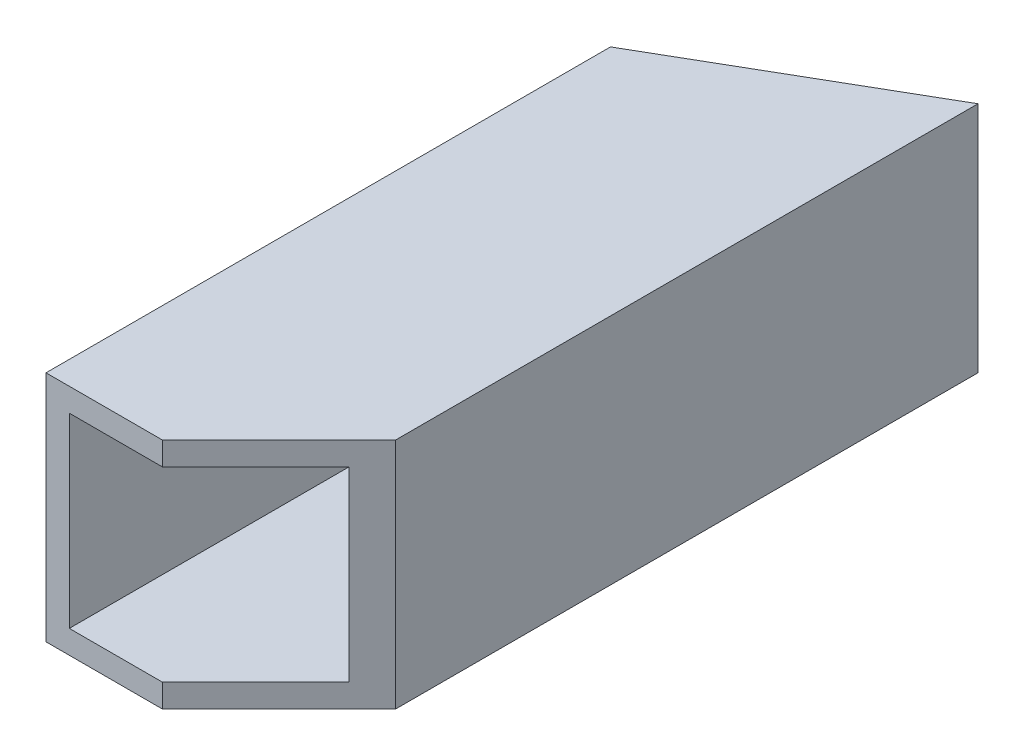
ISO-10303-21;
HEADER;
FILE_DESCRIPTION(('STEP AP214'),'2;1');
FILE_NAME('part.step','',(''),(''),'','','');
FILE_SCHEMA(('AUTOMOTIVE_DESIGN { 1 0 10303 214 1 1 1 1 }'));
ENDSEC;
DATA;
#1=APPLICATION_CONTEXT('core data for automotive mechanical design processes');
#2=APPLICATION_PROTOCOL_DEFINITION('international standard','automotive_design',2000,#1);
#3=PRODUCT_CONTEXT('',#1,'mechanical');
#4=PRODUCT('Part','Part','',(#3));
#5=PRODUCT_RELATED_PRODUCT_CATEGORY('part','',(#4));
#6=PRODUCT_DEFINITION_FORMATION('','',#4);
#7=PRODUCT_DEFINITION_CONTEXT('part definition',#1,'design');
#8=PRODUCT_DEFINITION('design','',#6,#7);
#9=PRODUCT_DEFINITION_SHAPE('','',#8);
#10=(LENGTH_UNIT() NAMED_UNIT(*) SI_UNIT(.MILLI.,.METRE.));
#11=(NAMED_UNIT(*) PLANE_ANGLE_UNIT() SI_UNIT($,.RADIAN.));
#12=(NAMED_UNIT(*) SI_UNIT($,.STERADIAN.) SOLID_ANGLE_UNIT());
#13=UNCERTAINTY_MEASURE_WITH_UNIT(LENGTH_MEASURE(1.E-05),#10,'distance_accuracy_value','');
#14=(GEOMETRIC_REPRESENTATION_CONTEXT(3) GLOBAL_UNCERTAINTY_ASSIGNED_CONTEXT((#13)) GLOBAL_UNIT_ASSIGNED_CONTEXT((#10,
#11,#12)) REPRESENTATION_CONTEXT('',''));
#15=CARTESIAN_POINT('',(0.,0.,0.));
#16=DIRECTION('',(0.,0.,1.));
#17=DIRECTION('',(1.,0.,0.));
#18=AXIS2_PLACEMENT_3D('',#15,#16,#17);
#19=CARTESIAN_POINT('',(-25.,25.,150.));
#20=DIRECTION('',(-1.,0.,0.));
#21=DIRECTION('',(0.,0.,1.));
#22=AXIS2_PLACEMENT_3D('',#19,#20,#21);
#23=PLANE('',#22);
#24=DIRECTION('',(0.,-1.,0.));
#25=VECTOR('',#24,1.);
#26=CARTESIAN_POINT('',(-25.,25.,28.8675134594809));
#27=LINE('',#26,#25);
#28=CARTESIAN_POINT('',(-25.,25.,28.8675134594809));
#29=VERTEX_POINT('',#28);
#30=CARTESIAN_POINT('',(-25.,-25.,28.8675134594809));
#31=VERTEX_POINT('',#30);
#32=EDGE_CURVE('E112',#29,#31,#27,.T.);
#33=ORIENTED_EDGE('',*,*,#32,.T.);
#34=DIRECTION('',(0.,0.,-1.));
#35=VECTOR('',#34,1.);
#36=CARTESIAN_POINT('',(-25.,-25.,150.));
#37=LINE('',#36,#35);
#38=CARTESIAN_POINT('',(-25.,-25.,150.));
#39=VERTEX_POINT('',#38);
#40=EDGE_CURVE('E144',#39,#31,#37,.T.);
#41=ORIENTED_EDGE('',*,*,#40,.F.);
#42=DIRECTION('',(0.,1.,0.));
#43=VECTOR('',#42,1.);
#44=CARTESIAN_POINT('',(-25.,25.,150.));
#45=LINE('',#44,#43);
#46=CARTESIAN_POINT('',(-25.,25.,150.));
#47=VERTEX_POINT('',#46);
#48=EDGE_CURVE('E136',#39,#47,#45,.T.);
#49=ORIENTED_EDGE('',*,*,#48,.T.);
#50=DIRECTION('',(0.,0.,-1.));
#51=VECTOR('',#50,1.);
#52=CARTESIAN_POINT('',(-25.,25.,150.));
#53=LINE('',#52,#51);
#54=EDGE_CURVE('E127',#47,#29,#53,.T.);
#55=ORIENTED_EDGE('',*,*,#54,.T.);
#56=EDGE_LOOP('',(#33,#41,#49,#55));
#57=FACE_BOUND('',#56,.T.);
#58=ADVANCED_FACE('F38',(#57),#23,.T.);
#59=CARTESIAN_POINT('',(-25.,-25.,150.));
#60=DIRECTION('',(0.,-1.,0.));
#61=DIRECTION('',(0.,0.,-1.));
#62=AXIS2_PLACEMENT_3D('',#59,#60,#61);
#63=PLANE('',#62);
#64=DIRECTION('',(-0.866025403784442,0.,0.499999999999995));
#65=VECTOR('',#64,1.);
#66=CARTESIAN_POINT('',(25.,-25.,0.));
#67=LINE('',#66,#65);
#68=CARTESIAN_POINT('',(25.,-25.,0.));
#69=VERTEX_POINT('',#68);
#70=EDGE_CURVE('E118',#69,#31,#67,.T.);
#71=ORIENTED_EDGE('',*,*,#70,.F.);
#72=DIRECTION('',(0.,0.,-1.));
#73=VECTOR('',#72,1.);
#74=CARTESIAN_POINT('',(25.,-25.,150.));
#75=LINE('',#74,#73);
#76=CARTESIAN_POINT('',(25.,-25.,125.));
#77=VERTEX_POINT('',#76);
#78=EDGE_CURVE('E139',#77,#69,#75,.T.);
#79=ORIENTED_EDGE('',*,*,#78,.F.);
#80=DIRECTION('',(0.707106781186552,0.,-0.707106781186544));
#81=VECTOR('',#80,1.);
#82=CARTESIAN_POINT('',(0.,-25.,150.));
#83=LINE('',#82,#81);
#84=CARTESIAN_POINT('',(0.,-25.,150.));
#85=VERTEX_POINT('',#84);
#86=EDGE_CURVE('E186',#85,#77,#83,.T.);
#87=ORIENTED_EDGE('',*,*,#86,.F.);
#88=DIRECTION('',(-1.,0.,0.));
#89=VECTOR('',#88,1.);
#90=CARTESIAN_POINT('',(-25.,-25.,150.));
#91=LINE('',#90,#89);
#92=EDGE_CURVE('E137',#85,#39,#91,.T.);
#93=ORIENTED_EDGE('',*,*,#92,.T.);
#94=ORIENTED_EDGE('',*,*,#40,.T.);
#95=EDGE_LOOP('',(#71,#79,#87,#93,#94));
#96=FACE_BOUND('',#95,.T.);
#97=ADVANCED_FACE('F223',(#96),#63,.T.);
#98=CARTESIAN_POINT('',(25.,25.,150.));
#99=DIRECTION('',(1.,0.,0.));
#100=DIRECTION('',(0.,0.,-1.));
#101=AXIS2_PLACEMENT_3D('',#98,#99,#100);
#102=PLANE('',#101);
#103=DIRECTION('',(0.,-1.,0.));
#104=VECTOR('',#103,1.);
#105=CARTESIAN_POINT('',(25.,25.,125.));
#106=LINE('',#105,#104);
#107=CARTESIAN_POINT('',(25.,25.,125.));
#108=VERTEX_POINT('',#107);
#109=EDGE_CURVE('E180',#108,#77,#106,.T.);
#110=ORIENTED_EDGE('',*,*,#109,.T.);
#111=ORIENTED_EDGE('',*,*,#78,.T.);
#112=DIRECTION('',(0.,-1.,0.));
#113=VECTOR('',#112,1.);
#114=CARTESIAN_POINT('',(25.,25.,0.));
#115=LINE('',#114,#113);
#116=CARTESIAN_POINT('',(25.,25.,0.));
#117=VERTEX_POINT('',#116);
#118=EDGE_CURVE('E153',#117,#69,#115,.T.);
#119=ORIENTED_EDGE('',*,*,#118,.F.);
#120=DIRECTION('',(0.,0.,-1.));
#121=VECTOR('',#120,1.);
#122=CARTESIAN_POINT('',(25.,25.,150.));
#123=LINE('',#122,#121);
#124=EDGE_CURVE('E131',#108,#117,#123,.T.);
#125=ORIENTED_EDGE('',*,*,#124,.F.);
#126=EDGE_LOOP('',(#110,#111,#119,#125));
#127=FACE_BOUND('',#126,.T.);
#128=ADVANCED_FACE('F227',(#127),#102,.T.);
#129=CARTESIAN_POINT('',(-25.,25.,150.));
#130=DIRECTION('',(0.,1.,0.));
#131=DIRECTION('',(0.,0.,1.));
#132=AXIS2_PLACEMENT_3D('',#129,#130,#131);
#133=PLANE('',#132);
#134=DIRECTION('',(-0.866025403784442,0.,0.499999999999995));
#135=VECTOR('',#134,1.);
#136=CARTESIAN_POINT('',(25.,25.,0.));
#137=LINE('',#136,#135);
#138=EDGE_CURVE('E115',#117,#29,#137,.T.);
#139=ORIENTED_EDGE('',*,*,#138,.T.);
#140=ORIENTED_EDGE('',*,*,#54,.F.);
#141=DIRECTION('',(1.,0.,0.));
#142=VECTOR('',#141,1.);
#143=CARTESIAN_POINT('',(-25.,25.,150.));
#144=LINE('',#143,#142);
#145=CARTESIAN_POINT('',(0.,25.,150.));
#146=VERTEX_POINT('',#145);
#147=EDGE_CURVE('E141',#47,#146,#144,.T.);
#148=ORIENTED_EDGE('',*,*,#147,.T.);
#149=DIRECTION('',(0.707106781186552,0.,-0.707106781186544));
#150=VECTOR('',#149,1.);
#151=CARTESIAN_POINT('',(0.,25.,150.));
#152=LINE('',#151,#150);
#153=EDGE_CURVE('E188',#146,#108,#152,.T.);
#154=ORIENTED_EDGE('',*,*,#153,.T.);
#155=ORIENTED_EDGE('',*,*,#124,.T.);
#156=EDGE_LOOP('',(#139,#140,#148,#154,#155));
#157=FACE_BOUND('',#156,.T.);
#158=ADVANCED_FACE('F125',(#157),#133,.T.);
#159=CARTESIAN_POINT('',(0.,0.,150.));
#160=DIRECTION('',(0.,0.,1.));
#161=DIRECTION('',(1.,0.,0.));
#162=AXIS2_PLACEMENT_3D('',#159,#160,#161);
#163=PLANE('',#162);
#164=DIRECTION('',(0.,-1.,0.));
#165=VECTOR('',#164,1.);
#166=CARTESIAN_POINT('',(0.,25.,150.));
#167=LINE('',#166,#165);
#168=CARTESIAN_POINT('',(0.,20.,150.));
#169=VERTEX_POINT('',#168);
#170=EDGE_CURVE('E181',#146,#169,#167,.T.);
#171=ORIENTED_EDGE('',*,*,#170,.F.);
#172=ORIENTED_EDGE('',*,*,#147,.F.);
#173=ORIENTED_EDGE('',*,*,#48,.F.);
#174=ORIENTED_EDGE('',*,*,#92,.F.);
#175=CARTESIAN_POINT('',(0.,-20.,150.));
#176=VERTEX_POINT('',#175);
#177=EDGE_CURVE('E183',#176,#85,#167,.T.);
#178=ORIENTED_EDGE('',*,*,#177,.F.);
#179=DIRECTION('',(-1.,0.,0.));
#180=VECTOR('',#179,1.);
#181=CARTESIAN_POINT('',(-20.,-20.,150.));
#182=LINE('',#181,#180);
#183=CARTESIAN_POINT('',(-20.,-20.,150.));
#184=VERTEX_POINT('',#183);
#185=EDGE_CURVE('E171',#176,#184,#182,.T.);
#186=ORIENTED_EDGE('',*,*,#185,.T.);
#187=DIRECTION('',(0.,1.,0.));
#188=VECTOR('',#187,1.);
#189=CARTESIAN_POINT('',(-20.,20.,150.));
#190=LINE('',#189,#188);
#191=CARTESIAN_POINT('',(-20.,20.,150.));
#192=VERTEX_POINT('',#191);
#193=EDGE_CURVE('E161',#184,#192,#190,.T.);
#194=ORIENTED_EDGE('',*,*,#193,.T.);
#195=DIRECTION('',(1.,0.,0.));
#196=VECTOR('',#195,1.);
#197=CARTESIAN_POINT('',(-20.,20.,150.));
#198=LINE('',#197,#196);
#199=EDGE_CURVE('E173',#192,#169,#198,.T.);
#200=ORIENTED_EDGE('',*,*,#199,.T.);
#201=EDGE_LOOP('',(#171,#172,#173,#174,#178,#186,#194,#200));
#202=FACE_BOUND('',#201,.T.);
#203=ADVANCED_FACE('F207',(#202),#163,.T.);
#204=CARTESIAN_POINT('',(-20.,20.,150.));
#205=DIRECTION('',(0.,1.,0.));
#206=DIRECTION('',(0.,0.,1.));
#207=AXIS2_PLACEMENT_3D('',#204,#205,#206);
#208=PLANE('',#207);
#209=DIRECTION('',(0.,0.,-1.));
#210=VECTOR('',#209,1.);
#211=CARTESIAN_POINT('',(-20.,20.,150.));
#212=LINE('',#211,#210);
#213=CARTESIAN_POINT('',(-20.,20.,25.9807621135328));
#214=VERTEX_POINT('',#213);
#215=EDGE_CURVE('E154',#192,#214,#212,.T.);
#216=ORIENTED_EDGE('',*,*,#215,.T.);
#217=DIRECTION('',(0.866025403784442,0.,-0.499999999999995));
#218=VECTOR('',#217,1.);
#219=CARTESIAN_POINT('',(-73.7019052838327,20.,56.9855715851489));
#220=LINE('',#219,#218);
#221=CARTESIAN_POINT('',(20.,20.,2.8867513459481));
#222=VERTEX_POINT('',#221);
#223=EDGE_CURVE('E189',#214,#222,#220,.T.);
#224=ORIENTED_EDGE('',*,*,#223,.T.);
#225=DIRECTION('',(0.,0.,-1.));
#226=VECTOR('',#225,1.);
#227=CARTESIAN_POINT('',(20.,20.,150.));
#228=LINE('',#227,#226);
#229=CARTESIAN_POINT('',(20.,20.,130.));
#230=VERTEX_POINT('',#229);
#231=EDGE_CURVE('E158',#230,#222,#228,.T.);
#232=ORIENTED_EDGE('',*,*,#231,.F.);
#233=DIRECTION('',(-0.707106781186551,0.,0.707106781186544));
#234=VECTOR('',#233,1.);
#235=CARTESIAN_POINT('',(-10.0000000000001,20.,160.));
#236=LINE('',#235,#234);
#237=EDGE_CURVE('E59',#230,#169,#236,.T.);
#238=ORIENTED_EDGE('',*,*,#237,.T.);
#239=ORIENTED_EDGE('',*,*,#199,.F.);
#240=EDGE_LOOP('',(#216,#224,#232,#238,#239));
#241=FACE_BOUND('',#240,.T.);
#242=ADVANCED_FACE('F212',(#241),#208,.F.);
#243=CARTESIAN_POINT('',(-20.,20.,150.));
#244=DIRECTION('',(-1.,0.,0.));
#245=DIRECTION('',(0.,0.,1.));
#246=AXIS2_PLACEMENT_3D('',#243,#244,#245);
#247=PLANE('',#246);
#248=DIRECTION('',(0.,0.,-1.));
#249=VECTOR('',#248,1.);
#250=CARTESIAN_POINT('',(-20.,-20.,150.));
#251=LINE('',#250,#249);
#252=CARTESIAN_POINT('',(-20.,-20.,25.9807621135328));
#253=VERTEX_POINT('',#252);
#254=EDGE_CURVE('E164',#184,#253,#251,.T.);
#255=ORIENTED_EDGE('',*,*,#254,.T.);
#256=DIRECTION('',(0.,1.,0.));
#257=VECTOR('',#256,1.);
#258=CARTESIAN_POINT('',(-20.,20.,25.9807621135328));
#259=LINE('',#258,#257);
#260=EDGE_CURVE('E193',#253,#214,#259,.T.);
#261=ORIENTED_EDGE('',*,*,#260,.T.);
#262=ORIENTED_EDGE('',*,*,#215,.F.);
#263=ORIENTED_EDGE('',*,*,#193,.F.);
#264=EDGE_LOOP('',(#255,#261,#262,#263));
#265=FACE_BOUND('',#264,.T.);
#266=ADVANCED_FACE('F203',(#265),#247,.F.);
#267=CARTESIAN_POINT('',(-20.,-20.,150.));
#268=DIRECTION('',(0.,-1.,0.));
#269=DIRECTION('',(0.,0.,-1.));
#270=AXIS2_PLACEMENT_3D('',#267,#268,#269);
#271=PLANE('',#270);
#272=DIRECTION('',(0.,0.,-1.));
#273=VECTOR('',#272,1.);
#274=CARTESIAN_POINT('',(20.,-20.,150.));
#275=LINE('',#274,#273);
#276=CARTESIAN_POINT('',(20.,-20.,130.));
#277=VERTEX_POINT('',#276);
#278=CARTESIAN_POINT('',(20.,-20.,2.8867513459481));
#279=VERTEX_POINT('',#278);
#280=EDGE_CURVE('E160',#277,#279,#275,.T.);
#281=ORIENTED_EDGE('',*,*,#280,.T.);
#282=DIRECTION('',(-0.866025403784442,0.,0.499999999999995));
#283=VECTOR('',#282,1.);
#284=CARTESIAN_POINT('',(-73.7019052838327,-20.,56.9855715851489));
#285=LINE('',#284,#283);
#286=EDGE_CURVE('E52',#279,#253,#285,.T.);
#287=ORIENTED_EDGE('',*,*,#286,.T.);
#288=ORIENTED_EDGE('',*,*,#254,.F.);
#289=ORIENTED_EDGE('',*,*,#185,.F.);
#290=DIRECTION('',(0.707106781186551,0.,-0.707106781186544));
#291=VECTOR('',#290,1.);
#292=CARTESIAN_POINT('',(-10.0000000000001,-20.,160.));
#293=LINE('',#292,#291);
#294=EDGE_CURVE('E177',#176,#277,#293,.T.);
#295=ORIENTED_EDGE('',*,*,#294,.T.);
#296=EDGE_LOOP('',(#281,#287,#288,#289,#295));
#297=FACE_BOUND('',#296,.T.);
#298=ADVANCED_FACE('F199',(#297),#271,.F.);
#299=CARTESIAN_POINT('',(20.,20.,150.));
#300=DIRECTION('',(1.,0.,0.));
#301=DIRECTION('',(0.,0.,-1.));
#302=AXIS2_PLACEMENT_3D('',#299,#300,#301);
#303=PLANE('',#302);
#304=ORIENTED_EDGE('',*,*,#231,.T.);
#305=DIRECTION('',(0.,-1.,0.));
#306=VECTOR('',#305,1.);
#307=CARTESIAN_POINT('',(20.,20.,2.8867513459481));
#308=LINE('',#307,#306);
#309=EDGE_CURVE('E11',#222,#279,#308,.T.);
#310=ORIENTED_EDGE('',*,*,#309,.T.);
#311=ORIENTED_EDGE('',*,*,#280,.F.);
#312=DIRECTION('',(0.,1.,0.));
#313=VECTOR('',#312,1.);
#314=CARTESIAN_POINT('',(20.,20.,130.));
#315=LINE('',#314,#313);
#316=EDGE_CURVE('E45',#277,#230,#315,.T.);
#317=ORIENTED_EDGE('',*,*,#316,.T.);
#318=EDGE_LOOP('',(#304,#310,#311,#317));
#319=FACE_BOUND('',#318,.T.);
#320=ADVANCED_FACE('F210',(#319),#303,.F.);
#321=CARTESIAN_POINT('',(0.,25.,150.));
#322=DIRECTION('',(-0.707106781186544,0.,-0.707106781186552));
#323=DIRECTION('',(-0.707106781186551,0.,0.707106781186544));
#324=AXIS2_PLACEMENT_3D('',#321,#322,#323);
#325=PLANE('',#324);
#326=ORIENTED_EDGE('',*,*,#316,.F.);
#327=ORIENTED_EDGE('',*,*,#294,.F.);
#328=ORIENTED_EDGE('',*,*,#177,.T.);
#329=ORIENTED_EDGE('',*,*,#86,.T.);
#330=ORIENTED_EDGE('',*,*,#109,.F.);
#331=ORIENTED_EDGE('',*,*,#153,.F.);
#332=ORIENTED_EDGE('',*,*,#170,.T.);
#333=ORIENTED_EDGE('',*,*,#237,.F.);
#334=EDGE_LOOP('',(#326,#327,#328,#329,#330,#331,#332,#333));
#335=FACE_BOUND('',#334,.T.);
#336=ADVANCED_FACE('F249',(#335),#325,.F.);
#337=CARTESIAN_POINT('',(25.,25.,0.));
#338=DIRECTION('',(0.499999999999995,0.,0.866025403784442));
#339=DIRECTION('',(0.866025403784442,0.,-0.499999999999995));
#340=AXIS2_PLACEMENT_3D('',#337,#338,#339);
#341=PLANE('',#340);
#342=ORIENTED_EDGE('',*,*,#70,.T.);
#343=ORIENTED_EDGE('',*,*,#32,.F.);
#344=ORIENTED_EDGE('',*,*,#138,.F.);
#345=ORIENTED_EDGE('',*,*,#118,.T.);
#346=EDGE_LOOP('',(#342,#343,#344,#345));
#347=FACE_BOUND('',#346,.T.);
#348=ORIENTED_EDGE('',*,*,#260,.F.);
#349=ORIENTED_EDGE('',*,*,#286,.F.);
#350=ORIENTED_EDGE('',*,*,#309,.F.);
#351=ORIENTED_EDGE('',*,*,#223,.F.);
#352=EDGE_LOOP('',(#348,#349,#350,#351));
#353=FACE_BOUND('',#352,.T.);
#354=ADVANCED_FACE('F114',(#347,#353),#341,.F.);
#355=CLOSED_SHELL('',(#58,#97,#128,#158,#203,#242,#266,#298,#320,#336,#354));
#356=MANIFOLD_SOLID_BREP('B2',#355);
#357=ADVANCED_BREP_SHAPE_REPRESENTATION('',(#18,#356),#14);
#358=SHAPE_DEFINITION_REPRESENTATION(#9,#357);
ENDSEC;
END-ISO-10303-21;
